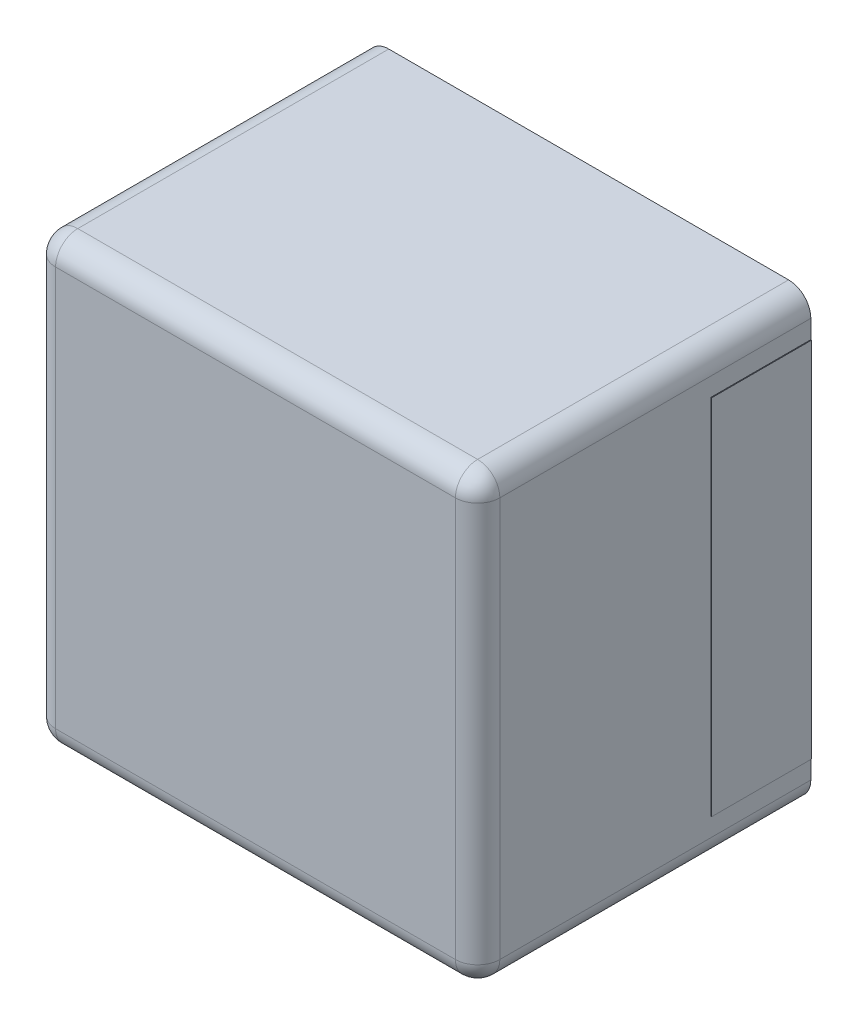
ISO-10303-21;
HEADER;
FILE_DESCRIPTION(('STEP AP214'),'2;1');
FILE_NAME('part.step','',(''),(''),'','','');
FILE_SCHEMA(('AUTOMOTIVE_DESIGN { 1 0 10303 214 1 1 1 1 }'));
ENDSEC;
DATA;
#1=APPLICATION_CONTEXT('core data for automotive mechanical design processes');
#2=APPLICATION_PROTOCOL_DEFINITION('international standard','automotive_design',2000,#1);
#3=PRODUCT_CONTEXT('',#1,'mechanical');
#4=PRODUCT('Part','Part','',(#3));
#5=PRODUCT_RELATED_PRODUCT_CATEGORY('part','',(#4));
#6=PRODUCT_DEFINITION_FORMATION('','',#4);
#7=PRODUCT_DEFINITION_CONTEXT('part definition',#1,'design');
#8=PRODUCT_DEFINITION('design','',#6,#7);
#9=PRODUCT_DEFINITION_SHAPE('','',#8);
#10=(LENGTH_UNIT() NAMED_UNIT(*) SI_UNIT(.MILLI.,.METRE.));
#11=(NAMED_UNIT(*) PLANE_ANGLE_UNIT() SI_UNIT($,.RADIAN.));
#12=(NAMED_UNIT(*) SI_UNIT($,.STERADIAN.) SOLID_ANGLE_UNIT());
#13=UNCERTAINTY_MEASURE_WITH_UNIT(LENGTH_MEASURE(1.E-05),#10,'distance_accuracy_value','');
#14=(GEOMETRIC_REPRESENTATION_CONTEXT(3) GLOBAL_UNCERTAINTY_ASSIGNED_CONTEXT((#13)) GLOBAL_UNIT_ASSIGNED_CONTEXT((#10,
#11,#12)) REPRESENTATION_CONTEXT('',''));
#15=CARTESIAN_POINT('',(0.,0.,0.));
#16=DIRECTION('',(0.,0.,1.));
#17=DIRECTION('',(1.,0.,0.));
#18=AXIS2_PLACEMENT_3D('',#15,#16,#17);
#19=CARTESIAN_POINT('',(-3.01,-2.45,0.));
#20=DIRECTION('',(1.,0.,0.));
#21=DIRECTION('',(0.,0.,-1.));
#22=AXIS2_PLACEMENT_3D('',#19,#20,#21);
#23=PLANE('',#22);
#24=DIRECTION('',(0.,0.,-1.));
#25=VECTOR('',#24,1.);
#26=CARTESIAN_POINT('',(-3.01,2.45,0.));
#27=LINE('',#26,#25);
#28=CARTESIAN_POINT('',(-3.01,2.45,0.));
#29=VERTEX_POINT('',#28);
#30=CARTESIAN_POINT('',(-3.01,2.45,1.35));
#31=VERTEX_POINT('',#30);
#32=EDGE_CURVE('E193',#29,#31,#27,.F.);
#33=ORIENTED_EDGE('',*,*,#32,.F.);
#34=DIRECTION('',(0.,1.,0.));
#35=VECTOR('',#34,1.);
#36=CARTESIAN_POINT('',(-3.01,-2.45,0.));
#37=LINE('',#36,#35);
#38=CARTESIAN_POINT('',(-3.01,-2.45,0.));
#39=VERTEX_POINT('',#38);
#40=EDGE_CURVE('E188',#29,#39,#37,.F.);
#41=ORIENTED_EDGE('',*,*,#40,.T.);
#42=DIRECTION('',(0.,0.,1.));
#43=VECTOR('',#42,1.);
#44=CARTESIAN_POINT('',(-3.01,-2.45,0.));
#45=LINE('',#44,#43);
#46=CARTESIAN_POINT('',(-3.01,-2.45,1.35));
#47=VERTEX_POINT('',#46);
#48=EDGE_CURVE('E206',#39,#47,#45,.T.);
#49=ORIENTED_EDGE('',*,*,#48,.T.);
#50=DIRECTION('',(0.,1.,0.));
#51=VECTOR('',#50,1.);
#52=CARTESIAN_POINT('',(-3.01,-2.45,1.35));
#53=LINE('',#52,#51);
#54=EDGE_CURVE('E202',#31,#47,#53,.F.);
#55=ORIENTED_EDGE('',*,*,#54,.F.);
#56=EDGE_LOOP('',(#33,#41,#49,#55));
#57=FACE_BOUND('',#56,.T.);
#58=ADVANCED_FACE('F17',(#57),#23,.F.);
#59=CARTESIAN_POINT('',(3.01,-2.45,0.));
#60=DIRECTION('',(1.,0.,0.));
#61=DIRECTION('',(0.,0.,-1.));
#62=AXIS2_PLACEMENT_3D('',#59,#60,#61);
#63=PLANE('',#62);
#64=DIRECTION('',(0.,0.,-1.));
#65=VECTOR('',#64,1.);
#66=CARTESIAN_POINT('',(3.01,2.45,0.));
#67=LINE('',#66,#65);
#68=CARTESIAN_POINT('',(3.01,2.45,0.));
#69=VERTEX_POINT('',#68);
#70=CARTESIAN_POINT('',(3.01,2.45,1.35));
#71=VERTEX_POINT('',#70);
#72=EDGE_CURVE('E189',#69,#71,#67,.F.);
#73=ORIENTED_EDGE('',*,*,#72,.T.);
#74=DIRECTION('',(0.,1.,0.));
#75=VECTOR('',#74,1.);
#76=CARTESIAN_POINT('',(3.01,-2.45,1.35));
#77=LINE('',#76,#75);
#78=CARTESIAN_POINT('',(3.01,-2.45,1.35));
#79=VERTEX_POINT('',#78);
#80=EDGE_CURVE('E178',#79,#71,#77,.T.);
#81=ORIENTED_EDGE('',*,*,#80,.F.);
#82=DIRECTION('',(0.,0.,1.));
#83=VECTOR('',#82,1.);
#84=CARTESIAN_POINT('',(3.01,-2.45,0.));
#85=LINE('',#84,#83);
#86=CARTESIAN_POINT('',(3.01,-2.45,0.));
#87=VERTEX_POINT('',#86);
#88=EDGE_CURVE('E196',#79,#87,#85,.F.);
#89=ORIENTED_EDGE('',*,*,#88,.T.);
#90=DIRECTION('',(0.,1.,0.));
#91=VECTOR('',#90,1.);
#92=CARTESIAN_POINT('',(3.01,-2.45,0.));
#93=LINE('',#92,#91);
#94=EDGE_CURVE('E185',#87,#69,#93,.T.);
#95=ORIENTED_EDGE('',*,*,#94,.T.);
#96=EDGE_LOOP('',(#73,#81,#89,#95));
#97=FACE_BOUND('',#96,.T.);
#98=ADVANCED_FACE('F517',(#97),#63,.T.);
#99=CARTESIAN_POINT('',(-3.01,-2.45,0.));
#100=DIRECTION('',(0.,1.,0.));
#101=DIRECTION('',(0.,0.,1.));
#102=AXIS2_PLACEMENT_3D('',#99,#100,#101);
#103=PLANE('',#102);
#104=DIRECTION('',(1.,0.,0.));
#105=VECTOR('',#104,1.);
#106=CARTESIAN_POINT('',(-3.01,-2.45,1.35));
#107=LINE('',#106,#105);
#108=CARTESIAN_POINT('',(-3.,-2.45,1.35));
#109=VERTEX_POINT('',#108);
#110=EDGE_CURVE('E205',#47,#109,#107,.T.);
#111=ORIENTED_EDGE('',*,*,#110,.F.);
#112=ORIENTED_EDGE('',*,*,#48,.F.);
#113=DIRECTION('',(1.,0.,0.));
#114=VECTOR('',#113,1.);
#115=CARTESIAN_POINT('',(-3.01,-2.45,0.));
#116=LINE('',#115,#114);
#117=CARTESIAN_POINT('',(-3.,-2.45,0.));
#118=VERTEX_POINT('',#117);
#119=EDGE_CURVE('E210',#118,#39,#116,.F.);
#120=ORIENTED_EDGE('',*,*,#119,.F.);
#121=DIRECTION('',(0.,0.,-1.));
#122=VECTOR('',#121,1.);
#123=CARTESIAN_POINT('',(-3.,-2.45,0.));
#124=LINE('',#123,#122);
#125=EDGE_CURVE('E168',#118,#109,#124,.F.);
#126=ORIENTED_EDGE('',*,*,#125,.T.);
#127=EDGE_LOOP('',(#111,#112,#120,#126));
#128=FACE_BOUND('',#127,.T.);
#129=ADVANCED_FACE('F328',(#128),#103,.F.);
#130=CARTESIAN_POINT('',(-3.01,-2.45,1.35));
#131=DIRECTION('',(0.,0.,1.));
#132=DIRECTION('',(1.,0.,0.));
#133=AXIS2_PLACEMENT_3D('',#130,#131,#132);
#134=PLANE('',#133);
#135=ORIENTED_EDGE('',*,*,#110,.T.);
#136=DIRECTION('',(0.,1.,0.));
#137=VECTOR('',#136,1.);
#138=CARTESIAN_POINT('',(-3.,-3.,1.35));
#139=LINE('',#138,#137);
#140=CARTESIAN_POINT('',(-3.,2.45,1.35));
#141=VERTEX_POINT('',#140);
#142=EDGE_CURVE('E170',#109,#141,#139,.T.);
#143=ORIENTED_EDGE('',*,*,#142,.T.);
#144=DIRECTION('',(1.,0.,0.));
#145=VECTOR('',#144,1.);
#146=CARTESIAN_POINT('',(-3.01,2.45,1.35));
#147=LINE('',#146,#145);
#148=EDGE_CURVE('E309',#31,#141,#147,.T.);
#149=ORIENTED_EDGE('',*,*,#148,.F.);
#150=ORIENTED_EDGE('',*,*,#54,.T.);
#151=EDGE_LOOP('',(#135,#143,#149,#150));
#152=FACE_BOUND('',#151,.T.);
#153=ADVANCED_FACE('F512',(#152),#134,.T.);
#154=CARTESIAN_POINT('',(-3.01,2.45,0.));
#155=DIRECTION('',(0.,1.,0.));
#156=DIRECTION('',(0.,0.,1.));
#157=AXIS2_PLACEMENT_3D('',#154,#155,#156);
#158=PLANE('',#157);
#159=ORIENTED_EDGE('',*,*,#148,.T.);
#160=DIRECTION('',(0.,0.,-1.));
#161=VECTOR('',#160,1.);
#162=CARTESIAN_POINT('',(-3.,2.45,0.));
#163=LINE('',#162,#161);
#164=CARTESIAN_POINT('',(-3.,2.45,0.));
#165=VERTEX_POINT('',#164);
#166=EDGE_CURVE('E299',#141,#165,#163,.T.);
#167=ORIENTED_EDGE('',*,*,#166,.T.);
#168=DIRECTION('',(1.,0.,0.));
#169=VECTOR('',#168,1.);
#170=CARTESIAN_POINT('',(-3.01,2.45,0.));
#171=LINE('',#170,#169);
#172=EDGE_CURVE('E306',#165,#29,#171,.F.);
#173=ORIENTED_EDGE('',*,*,#172,.T.);
#174=ORIENTED_EDGE('',*,*,#32,.T.);
#175=EDGE_LOOP('',(#159,#167,#173,#174));
#176=FACE_BOUND('',#175,.T.);
#177=ADVANCED_FACE('F333',(#176),#158,.T.);
#178=CARTESIAN_POINT('',(-2.7,-2.7,0.));
#179=DIRECTION('',(0.,0.,1.));
#180=DIRECTION('',(1.,0.,0.));
#181=AXIS2_PLACEMENT_3D('',#178,#179,#180);
#182=CYLINDRICAL_SURFACE('',#181,0.3);
#183=DIRECTION('',(0.,0.,1.));
#184=VECTOR('',#183,1.);
#185=CARTESIAN_POINT('',(-2.7,-3.,0.));
#186=LINE('',#185,#184);
#187=CARTESIAN_POINT('',(-2.7,-3.,0.));
#188=VERTEX_POINT('',#187);
#189=CARTESIAN_POINT('',(-2.7,-3.,4.2));
#190=VERTEX_POINT('',#189);
#191=EDGE_CURVE('E267',#188,#190,#186,.T.);
#192=ORIENTED_EDGE('',*,*,#191,.T.);
#193=CARTESIAN_POINT('',(-2.7,-2.7,4.2));
#194=DIRECTION('',(0.,0.,-1.));
#195=DIRECTION('',(0.,-1.,0.));
#196=AXIS2_PLACEMENT_3D('',#193,#194,#195);
#197=CIRCLE('',#196,0.3);
#198=CARTESIAN_POINT('',(-3.,-2.7,4.2));
#199=VERTEX_POINT('',#198);
#200=EDGE_CURVE('E145',#199,#190,#197,.F.);
#201=ORIENTED_EDGE('',*,*,#200,.F.);
#202=DIRECTION('',(0.,0.,-1.));
#203=VECTOR('',#202,1.);
#204=CARTESIAN_POINT('',(-3.,-2.7,0.));
#205=LINE('',#204,#203);
#206=CARTESIAN_POINT('',(-3.,-2.7,0.));
#207=VERTEX_POINT('',#206);
#208=EDGE_CURVE('E140',#199,#207,#205,.T.);
#209=ORIENTED_EDGE('',*,*,#208,.T.);
#210=CARTESIAN_POINT('',(-2.7,-2.7,0.));
#211=DIRECTION('',(0.,0.,1.));
#212=DIRECTION('',(1.,0.,0.));
#213=AXIS2_PLACEMENT_3D('',#210,#211,#212);
#214=CIRCLE('',#213,0.3);
#215=EDGE_CURVE('E20',#207,#188,#214,.T.);
#216=ORIENTED_EDGE('',*,*,#215,.T.);
#217=EDGE_LOOP('',(#192,#201,#209,#216));
#218=FACE_BOUND('',#217,.T.);
#219=ADVANCED_FACE('F142',(#218),#182,.T.);
#220=CARTESIAN_POINT('',(2.7,-2.7,0.));
#221=DIRECTION('',(0.,0.,1.));
#222=DIRECTION('',(1.,0.,0.));
#223=AXIS2_PLACEMENT_3D('',#220,#221,#222);
#224=CYLINDRICAL_SURFACE('',#223,0.3);
#225=CARTESIAN_POINT('',(2.7,-2.7,0.));
#226=DIRECTION('',(0.,0.,1.));
#227=DIRECTION('',(1.,0.,0.));
#228=AXIS2_PLACEMENT_3D('',#225,#226,#227);
#229=CIRCLE('',#228,0.3);
#230=CARTESIAN_POINT('',(2.7,-3.,0.));
#231=VERTEX_POINT('',#230);
#232=CARTESIAN_POINT('',(3.,-2.7,0.));
#233=VERTEX_POINT('',#232);
#234=EDGE_CURVE('E162',#231,#233,#229,.T.);
#235=ORIENTED_EDGE('',*,*,#234,.T.);
#236=DIRECTION('',(0.,0.,-1.));
#237=VECTOR('',#236,1.);
#238=CARTESIAN_POINT('',(3.,-2.7,0.));
#239=LINE('',#238,#237);
#240=CARTESIAN_POINT('',(3.,-2.7,4.2));
#241=VERTEX_POINT('',#240);
#242=EDGE_CURVE('E225',#241,#233,#239,.T.);
#243=ORIENTED_EDGE('',*,*,#242,.F.);
#244=CARTESIAN_POINT('',(2.7,-2.7,4.2));
#245=DIRECTION('',(0.,0.,-1.));
#246=DIRECTION('',(1.,0.,0.));
#247=AXIS2_PLACEMENT_3D('',#244,#245,#246);
#248=CIRCLE('',#247,0.3);
#249=CARTESIAN_POINT('',(2.7,-3.,4.2));
#250=VERTEX_POINT('',#249);
#251=EDGE_CURVE('E244',#250,#241,#248,.F.);
#252=ORIENTED_EDGE('',*,*,#251,.F.);
#253=DIRECTION('',(0.,0.,1.));
#254=VECTOR('',#253,1.);
#255=CARTESIAN_POINT('',(2.7,-3.,0.));
#256=LINE('',#255,#254);
#257=EDGE_CURVE('E228',#250,#231,#256,.F.);
#258=ORIENTED_EDGE('',*,*,#257,.T.);
#259=EDGE_LOOP('',(#235,#243,#252,#258));
#260=FACE_BOUND('',#259,.T.);
#261=ADVANCED_FACE('F223',(#260),#224,.T.);
#262=CARTESIAN_POINT('',(1.31,-2.45,0.));
#263=DIRECTION('',(0.,1.,0.));
#264=DIRECTION('',(0.,0.,1.));
#265=AXIS2_PLACEMENT_3D('',#262,#263,#264);
#266=PLANE('',#265);
#267=DIRECTION('',(1.,0.,0.));
#268=VECTOR('',#267,1.);
#269=CARTESIAN_POINT('',(1.31,-2.45,1.35));
#270=LINE('',#269,#268);
#271=CARTESIAN_POINT('',(3.,-2.45,1.35));
#272=VERTEX_POINT('',#271);
#273=EDGE_CURVE('E182',#272,#79,#270,.T.);
#274=ORIENTED_EDGE('',*,*,#273,.F.);
#275=DIRECTION('',(0.,0.,-1.));
#276=VECTOR('',#275,1.);
#277=CARTESIAN_POINT('',(3.,-2.45,0.));
#278=LINE('',#277,#276);
#279=CARTESIAN_POINT('',(3.,-2.45,0.));
#280=VERTEX_POINT('',#279);
#281=EDGE_CURVE('E235',#280,#272,#278,.F.);
#282=ORIENTED_EDGE('',*,*,#281,.F.);
#283=DIRECTION('',(1.,0.,0.));
#284=VECTOR('',#283,1.);
#285=CARTESIAN_POINT('',(1.31,-2.45,0.));
#286=LINE('',#285,#284);
#287=EDGE_CURVE('E199',#87,#280,#286,.F.);
#288=ORIENTED_EDGE('',*,*,#287,.F.);
#289=ORIENTED_EDGE('',*,*,#88,.F.);
#290=EDGE_LOOP('',(#274,#282,#288,#289));
#291=FACE_BOUND('',#290,.T.);
#292=ADVANCED_FACE('F385',(#291),#266,.F.);
#293=CARTESIAN_POINT('',(1.31,-2.45,1.35));
#294=DIRECTION('',(0.,0.,1.));
#295=DIRECTION('',(1.,0.,0.));
#296=AXIS2_PLACEMENT_3D('',#293,#294,#295);
#297=PLANE('',#296);
#298=ORIENTED_EDGE('',*,*,#80,.T.);
#299=DIRECTION('',(1.,0.,0.));
#300=VECTOR('',#299,1.);
#301=CARTESIAN_POINT('',(1.31,2.45,1.35));
#302=LINE('',#301,#300);
#303=CARTESIAN_POINT('',(3.,2.45,1.35));
#304=VERTEX_POINT('',#303);
#305=EDGE_CURVE('E163',#304,#71,#302,.T.);
#306=ORIENTED_EDGE('',*,*,#305,.F.);
#307=DIRECTION('',(0.,1.,0.));
#308=VECTOR('',#307,1.);
#309=CARTESIAN_POINT('',(3.,-3.,1.35));
#310=LINE('',#309,#308);
#311=EDGE_CURVE('E360',#272,#304,#310,.T.);
#312=ORIENTED_EDGE('',*,*,#311,.F.);
#313=ORIENTED_EDGE('',*,*,#273,.T.);
#314=EDGE_LOOP('',(#298,#306,#312,#313));
#315=FACE_BOUND('',#314,.T.);
#316=ADVANCED_FACE('F388',(#315),#297,.T.);
#317=CARTESIAN_POINT('',(1.31,2.45,0.));
#318=DIRECTION('',(0.,1.,0.));
#319=DIRECTION('',(0.,0.,1.));
#320=AXIS2_PLACEMENT_3D('',#317,#318,#319);
#321=PLANE('',#320);
#322=ORIENTED_EDGE('',*,*,#305,.T.);
#323=ORIENTED_EDGE('',*,*,#72,.F.);
#324=DIRECTION('',(1.,0.,0.));
#325=VECTOR('',#324,1.);
#326=CARTESIAN_POINT('',(1.31,2.45,0.));
#327=LINE('',#326,#325);
#328=CARTESIAN_POINT('',(3.,2.45,0.));
#329=VERTEX_POINT('',#328);
#330=EDGE_CURVE('E181',#69,#329,#327,.F.);
#331=ORIENTED_EDGE('',*,*,#330,.T.);
#332=DIRECTION('',(0.,0.,-1.));
#333=VECTOR('',#332,1.);
#334=CARTESIAN_POINT('',(3.,2.45,0.));
#335=LINE('',#334,#333);
#336=EDGE_CURVE('E355',#304,#329,#335,.T.);
#337=ORIENTED_EDGE('',*,*,#336,.F.);
#338=EDGE_LOOP('',(#322,#323,#331,#337));
#339=FACE_BOUND('',#338,.T.);
#340=ADVANCED_FACE('F391',(#339),#321,.T.);
#341=CARTESIAN_POINT('',(-2.7,2.7,0.));
#342=DIRECTION('',(0.,0.,1.));
#343=DIRECTION('',(1.,0.,0.));
#344=AXIS2_PLACEMENT_3D('',#341,#342,#343);
#345=CYLINDRICAL_SURFACE('',#344,0.3);
#346=CARTESIAN_POINT('',(-2.7,2.7,0.));
#347=DIRECTION('',(0.,0.,1.));
#348=DIRECTION('',(1.,0.,0.));
#349=AXIS2_PLACEMENT_3D('',#346,#347,#348);
#350=CIRCLE('',#349,0.3);
#351=CARTESIAN_POINT('',(-2.7,3.,0.));
#352=VERTEX_POINT('',#351);
#353=CARTESIAN_POINT('',(-3.,2.7,0.));
#354=VERTEX_POINT('',#353);
#355=EDGE_CURVE('E152',#352,#354,#350,.T.);
#356=ORIENTED_EDGE('',*,*,#355,.T.);
#357=DIRECTION('',(0.,0.,-1.));
#358=VECTOR('',#357,1.);
#359=CARTESIAN_POINT('',(-3.,2.7,0.));
#360=LINE('',#359,#358);
#361=CARTESIAN_POINT('',(-3.,2.7,4.2));
#362=VERTEX_POINT('',#361);
#363=EDGE_CURVE('E280',#354,#362,#360,.F.);
#364=ORIENTED_EDGE('',*,*,#363,.T.);
#365=CARTESIAN_POINT('',(-2.7,2.7,4.2));
#366=DIRECTION('',(0.,0.,-1.));
#367=DIRECTION('',(-1.,0.,0.));
#368=AXIS2_PLACEMENT_3D('',#365,#366,#367);
#369=CIRCLE('',#368,0.3);
#370=CARTESIAN_POINT('',(-2.7,3.,4.2));
#371=VERTEX_POINT('',#370);
#372=EDGE_CURVE('E399',#371,#362,#369,.F.);
#373=ORIENTED_EDGE('',*,*,#372,.F.);
#374=DIRECTION('',(0.,0.,1.));
#375=VECTOR('',#374,1.);
#376=CARTESIAN_POINT('',(-2.7,3.,0.));
#377=LINE('',#376,#375);
#378=EDGE_CURVE('E423',#352,#371,#377,.T.);
#379=ORIENTED_EDGE('',*,*,#378,.F.);
#380=EDGE_LOOP('',(#356,#364,#373,#379));
#381=FACE_BOUND('',#380,.T.);
#382=ADVANCED_FACE('F422',(#381),#345,.T.);
#383=CARTESIAN_POINT('',(2.7,2.7,0.));
#384=DIRECTION('',(0.,0.,1.));
#385=DIRECTION('',(1.,0.,0.));
#386=AXIS2_PLACEMENT_3D('',#383,#384,#385);
#387=CYLINDRICAL_SURFACE('',#386,0.3);
#388=DIRECTION('',(0.,0.,1.));
#389=VECTOR('',#388,1.);
#390=CARTESIAN_POINT('',(2.7,3.,0.));
#391=LINE('',#390,#389);
#392=CARTESIAN_POINT('',(2.7,3.,4.2));
#393=VERTEX_POINT('',#392);
#394=CARTESIAN_POINT('',(2.7,3.,0.));
#395=VERTEX_POINT('',#394);
#396=EDGE_CURVE('E427',#393,#395,#391,.F.);
#397=ORIENTED_EDGE('',*,*,#396,.F.);
#398=CARTESIAN_POINT('',(2.7,2.7,4.2));
#399=DIRECTION('',(0.,0.,-1.));
#400=DIRECTION('',(0.,1.,0.));
#401=AXIS2_PLACEMENT_3D('',#398,#399,#400);
#402=CIRCLE('',#401,0.3);
#403=CARTESIAN_POINT('',(3.,2.7,4.2));
#404=VERTEX_POINT('',#403);
#405=EDGE_CURVE('E398',#404,#393,#402,.F.);
#406=ORIENTED_EDGE('',*,*,#405,.F.);
#407=DIRECTION('',(0.,0.,-1.));
#408=VECTOR('',#407,1.);
#409=CARTESIAN_POINT('',(3.,2.7,0.));
#410=LINE('',#409,#408);
#411=CARTESIAN_POINT('',(3.,2.7,0.));
#412=VERTEX_POINT('',#411);
#413=EDGE_CURVE('E354',#412,#404,#410,.F.);
#414=ORIENTED_EDGE('',*,*,#413,.F.);
#415=CARTESIAN_POINT('',(2.7,2.7,0.));
#416=DIRECTION('',(0.,0.,1.));
#417=DIRECTION('',(1.,0.,0.));
#418=AXIS2_PLACEMENT_3D('',#415,#416,#417);
#419=CIRCLE('',#418,0.3);
#420=EDGE_CURVE('E220',#412,#395,#419,.T.);
#421=ORIENTED_EDGE('',*,*,#420,.T.);
#422=EDGE_LOOP('',(#397,#406,#414,#421));
#423=FACE_BOUND('',#422,.T.);
#424=ADVANCED_FACE('F397',(#423),#387,.T.);
#425=CARTESIAN_POINT('',(-3.,-3.,0.));
#426=DIRECTION('',(0.,0.,1.));
#427=DIRECTION('',(1.,0.,0.));
#428=AXIS2_PLACEMENT_3D('',#425,#426,#427);
#429=PLANE('',#428);
#430=DIRECTION('',(0.,1.,0.));
#431=VECTOR('',#430,1.);
#432=CARTESIAN_POINT('',(-3.,-3.,0.));
#433=LINE('',#432,#431);
#434=EDGE_CURVE('E151',#207,#118,#433,.T.);
#435=ORIENTED_EDGE('',*,*,#434,.T.);
#436=ORIENTED_EDGE('',*,*,#119,.T.);
#437=ORIENTED_EDGE('',*,*,#40,.F.);
#438=ORIENTED_EDGE('',*,*,#172,.F.);
#439=DIRECTION('',(0.,1.,0.));
#440=VECTOR('',#439,1.);
#441=CARTESIAN_POINT('',(-3.,-3.,0.));
#442=LINE('',#441,#440);
#443=EDGE_CURVE('E296',#165,#354,#442,.T.);
#444=ORIENTED_EDGE('',*,*,#443,.T.);
#445=ORIENTED_EDGE('',*,*,#355,.F.);
#446=DIRECTION('',(1.,0.,0.));
#447=VECTOR('',#446,1.);
#448=CARTESIAN_POINT('',(-3.,3.,0.));
#449=LINE('',#448,#447);
#450=EDGE_CURVE('E291',#395,#352,#449,.F.);
#451=ORIENTED_EDGE('',*,*,#450,.F.);
#452=ORIENTED_EDGE('',*,*,#420,.F.);
#453=DIRECTION('',(0.,1.,0.));
#454=VECTOR('',#453,1.);
#455=CARTESIAN_POINT('',(3.,-3.,0.));
#456=LINE('',#455,#454);
#457=EDGE_CURVE('E352',#329,#412,#456,.T.);
#458=ORIENTED_EDGE('',*,*,#457,.F.);
#459=ORIENTED_EDGE('',*,*,#330,.F.);
#460=ORIENTED_EDGE('',*,*,#94,.F.);
#461=ORIENTED_EDGE('',*,*,#287,.T.);
#462=DIRECTION('',(0.,1.,0.));
#463=VECTOR('',#462,1.);
#464=CARTESIAN_POINT('',(3.,-3.,0.));
#465=LINE('',#464,#463);
#466=EDGE_CURVE('E230',#233,#280,#465,.T.);
#467=ORIENTED_EDGE('',*,*,#466,.F.);
#468=ORIENTED_EDGE('',*,*,#234,.F.);
#469=DIRECTION('',(1.,0.,0.));
#470=VECTOR('',#469,1.);
#471=CARTESIAN_POINT('',(-3.,-3.,0.));
#472=LINE('',#471,#470);
#473=EDGE_CURVE('E160',#231,#188,#472,.F.);
#474=ORIENTED_EDGE('',*,*,#473,.T.);
#475=ORIENTED_EDGE('',*,*,#215,.F.);
#476=EDGE_LOOP('',(#435,#436,#437,#438,#444,#445,#451,#452,#458,#459,#460,#461,#467,#468,#474,#475));
#477=FACE_BOUND('',#476,.T.);
#478=ADVANCED_FACE('F155',(#477),#429,.F.);
#479=CARTESIAN_POINT('',(-3.,-3.,0.));
#480=DIRECTION('',(1.,0.,0.));
#481=DIRECTION('',(0.,0.,-1.));
#482=AXIS2_PLACEMENT_3D('',#479,#480,#481);
#483=PLANE('',#482);
#484=ORIENTED_EDGE('',*,*,#443,.F.);
#485=ORIENTED_EDGE('',*,*,#166,.F.);
#486=ORIENTED_EDGE('',*,*,#142,.F.);
#487=ORIENTED_EDGE('',*,*,#125,.F.);
#488=ORIENTED_EDGE('',*,*,#434,.F.);
#489=ORIENTED_EDGE('',*,*,#208,.F.);
#490=DIRECTION('',(0.,1.,0.));
#491=VECTOR('',#490,1.);
#492=CARTESIAN_POINT('',(-3.,-2.7,4.2));
#493=LINE('',#492,#491);
#494=EDGE_CURVE('E263',#362,#199,#493,.F.);
#495=ORIENTED_EDGE('',*,*,#494,.F.);
#496=ORIENTED_EDGE('',*,*,#363,.F.);
#497=EDGE_LOOP('',(#484,#485,#486,#487,#488,#489,#495,#496));
#498=FACE_BOUND('',#497,.T.);
#499=ADVANCED_FACE('F166',(#498),#483,.F.);
#500=CARTESIAN_POINT('',(-2.7,-2.7,4.2));
#501=DIRECTION('',(0.,-1.,0.));
#502=DIRECTION('',(1.,0.,0.));
#503=AXIS2_PLACEMENT_3D('',#500,#501,#502);
#504=SPHERICAL_SURFACE('',#503,0.3);
#505=ORIENTED_EDGE('',*,*,#200,.T.);
#506=CARTESIAN_POINT('',(-2.7,-2.7,4.2));
#507=DIRECTION('',(-1.,0.,0.));
#508=DIRECTION('',(0.,0.,1.));
#509=AXIS2_PLACEMENT_3D('',#506,#507,#508);
#510=CIRCLE('',#509,0.3);
#511=CARTESIAN_POINT('',(-2.69999999999847,-2.7,4.5));
#512=VERTEX_POINT('',#511);
#513=EDGE_CURVE('E262',#512,#190,#510,.F.);
#514=ORIENTED_EDGE('',*,*,#513,.F.);
#515=CARTESIAN_POINT('',(-2.7,-2.7,4.2));
#516=DIRECTION('',(0.,1.,0.));
#517=DIRECTION('',(0.,0.,1.));
#518=AXIS2_PLACEMENT_3D('',#515,#516,#517);
#519=CIRCLE('',#518,0.3);
#520=EDGE_CURVE('E287',#199,#512,#519,.T.);
#521=ORIENTED_EDGE('',*,*,#520,.F.);
#522=EDGE_LOOP('',(#505,#514,#521));
#523=FACE_BOUND('',#522,.T.);
#524=ADVANCED_FACE('F488',(#523),#504,.T.);
#525=CARTESIAN_POINT('',(-3.,-3.,0.));
#526=DIRECTION('',(0.,1.,0.));
#527=DIRECTION('',(0.,0.,1.));
#528=AXIS2_PLACEMENT_3D('',#525,#526,#527);
#529=PLANE('',#528);
#530=ORIENTED_EDGE('',*,*,#257,.F.);
#531=DIRECTION('',(-1.,0.,0.));
#532=VECTOR('',#531,1.);
#533=CARTESIAN_POINT('',(2.7,-3.,4.2));
#534=LINE('',#533,#532);
#535=EDGE_CURVE('E270',#190,#250,#534,.F.);
#536=ORIENTED_EDGE('',*,*,#535,.F.);
#537=ORIENTED_EDGE('',*,*,#191,.F.);
#538=ORIENTED_EDGE('',*,*,#473,.F.);
#539=EDGE_LOOP('',(#530,#536,#537,#538));
#540=FACE_BOUND('',#539,.T.);
#541=ADVANCED_FACE('F482',(#540),#529,.F.);
#542=CARTESIAN_POINT('',(2.7,-2.7,4.2));
#543=DIRECTION('',(1.,0.,0.));
#544=DIRECTION('',(0.,1.,0.));
#545=AXIS2_PLACEMENT_3D('',#542,#543,#544);
#546=SPHERICAL_SURFACE('',#545,0.3);
#547=ORIENTED_EDGE('',*,*,#251,.T.);
#548=CARTESIAN_POINT('',(2.7,-2.7,4.2));
#549=DIRECTION('',(0.,-1.,0.));
#550=DIRECTION('',(0.,0.,-1.));
#551=AXIS2_PLACEMENT_3D('',#548,#549,#550);
#552=CIRCLE('',#551,0.3);
#553=CARTESIAN_POINT('',(2.7,-2.69999999999847,4.5));
#554=VERTEX_POINT('',#553);
#555=EDGE_CURVE('E254',#554,#241,#552,.F.);
#556=ORIENTED_EDGE('',*,*,#555,.F.);
#557=CARTESIAN_POINT('',(2.7,-2.7,4.2));
#558=DIRECTION('',(-1.,0.,0.));
#559=DIRECTION('',(0.,0.,1.));
#560=AXIS2_PLACEMENT_3D('',#557,#558,#559);
#561=CIRCLE('',#560,0.3);
#562=EDGE_CURVE('E259',#250,#554,#561,.T.);
#563=ORIENTED_EDGE('',*,*,#562,.F.);
#564=EDGE_LOOP('',(#547,#556,#563));
#565=FACE_BOUND('',#564,.T.);
#566=ADVANCED_FACE('F479',(#565),#546,.T.);
#567=CARTESIAN_POINT('',(3.,-3.,0.));
#568=DIRECTION('',(1.,0.,0.));
#569=DIRECTION('',(0.,0.,-1.));
#570=AXIS2_PLACEMENT_3D('',#567,#568,#569);
#571=PLANE('',#570);
#572=ORIENTED_EDGE('',*,*,#457,.T.);
#573=ORIENTED_EDGE('',*,*,#413,.T.);
#574=DIRECTION('',(0.,-1.,0.));
#575=VECTOR('',#574,1.);
#576=CARTESIAN_POINT('',(3.,2.7,4.2));
#577=LINE('',#576,#575);
#578=EDGE_CURVE('E242',#241,#404,#577,.F.);
#579=ORIENTED_EDGE('',*,*,#578,.F.);
#580=ORIENTED_EDGE('',*,*,#242,.T.);
#581=ORIENTED_EDGE('',*,*,#466,.T.);
#582=ORIENTED_EDGE('',*,*,#281,.T.);
#583=ORIENTED_EDGE('',*,*,#311,.T.);
#584=ORIENTED_EDGE('',*,*,#336,.T.);
#585=EDGE_LOOP('',(#572,#573,#579,#580,#581,#582,#583,#584));
#586=FACE_BOUND('',#585,.T.);
#587=ADVANCED_FACE('F239',(#586),#571,.T.);
#588=CARTESIAN_POINT('',(-2.7,2.7,4.2));
#589=DIRECTION('',(-1.,0.,0.));
#590=DIRECTION('',(0.,-1.,0.));
#591=AXIS2_PLACEMENT_3D('',#588,#589,#590);
#592=SPHERICAL_SURFACE('',#591,0.3);
#593=ORIENTED_EDGE('',*,*,#372,.T.);
#594=CARTESIAN_POINT('',(-2.7,2.7,4.2));
#595=DIRECTION('',(0.,1.,0.));
#596=DIRECTION('',(0.,0.,1.));
#597=AXIS2_PLACEMENT_3D('',#594,#595,#596);
#598=CIRCLE('',#597,0.3);
#599=CARTESIAN_POINT('',(-2.7,2.69999999999847,4.5));
#600=VERTEX_POINT('',#599);
#601=EDGE_CURVE('E290',#600,#362,#598,.F.);
#602=ORIENTED_EDGE('',*,*,#601,.F.);
#603=CARTESIAN_POINT('',(-2.7,2.7,4.2));
#604=DIRECTION('',(1.,0.,0.));
#605=DIRECTION('',(0.,0.,-1.));
#606=AXIS2_PLACEMENT_3D('',#603,#604,#605);
#607=CIRCLE('',#606,0.3);
#608=EDGE_CURVE('E409',#371,#600,#607,.T.);
#609=ORIENTED_EDGE('',*,*,#608,.F.);
#610=EDGE_LOOP('',(#593,#602,#609));
#611=FACE_BOUND('',#610,.T.);
#612=ADVANCED_FACE('F420',(#611),#592,.T.);
#613=CARTESIAN_POINT('',(2.7,2.7,4.2));
#614=DIRECTION('',(0.,1.,0.));
#615=DIRECTION('',(-1.,0.,0.));
#616=AXIS2_PLACEMENT_3D('',#613,#614,#615);
#617=SPHERICAL_SURFACE('',#616,0.3);
#618=ORIENTED_EDGE('',*,*,#405,.T.);
#619=CARTESIAN_POINT('',(2.7,2.7,4.2));
#620=DIRECTION('',(1.,0.,0.));
#621=DIRECTION('',(0.,0.,-1.));
#622=AXIS2_PLACEMENT_3D('',#619,#620,#621);
#623=CIRCLE('',#622,0.3);
#624=CARTESIAN_POINT('',(2.69999999999847,2.7,4.5));
#625=VERTEX_POINT('',#624);
#626=EDGE_CURVE('E35',#625,#393,#623,.F.);
#627=ORIENTED_EDGE('',*,*,#626,.F.);
#628=CARTESIAN_POINT('',(2.7,2.7,4.2));
#629=DIRECTION('',(0.,-1.,0.));
#630=DIRECTION('',(0.,0.,-1.));
#631=AXIS2_PLACEMENT_3D('',#628,#629,#630);
#632=CIRCLE('',#631,0.3);
#633=EDGE_CURVE('E256',#404,#625,#632,.T.);
#634=ORIENTED_EDGE('',*,*,#633,.F.);
#635=EDGE_LOOP('',(#618,#627,#634));
#636=FACE_BOUND('',#635,.T.);
#637=ADVANCED_FACE('F469',(#636),#617,.T.);
#638=CARTESIAN_POINT('',(-3.,3.,0.));
#639=DIRECTION('',(0.,1.,0.));
#640=DIRECTION('',(0.,0.,1.));
#641=AXIS2_PLACEMENT_3D('',#638,#639,#640);
#642=PLANE('',#641);
#643=ORIENTED_EDGE('',*,*,#396,.T.);
#644=ORIENTED_EDGE('',*,*,#450,.T.);
#645=ORIENTED_EDGE('',*,*,#378,.T.);
#646=DIRECTION('',(1.,0.,0.));
#647=VECTOR('',#646,1.);
#648=CARTESIAN_POINT('',(-2.7,3.,4.2));
#649=LINE('',#648,#647);
#650=EDGE_CURVE('E438',#393,#371,#649,.F.);
#651=ORIENTED_EDGE('',*,*,#650,.F.);
#652=EDGE_LOOP('',(#643,#644,#645,#651));
#653=FACE_BOUND('',#652,.T.);
#654=ADVANCED_FACE('F473',(#653),#642,.T.);
#655=CARTESIAN_POINT('',(-2.7,-2.7,4.2));
#656=DIRECTION('',(0.,1.,0.));
#657=DIRECTION('',(0.,0.,1.));
#658=AXIS2_PLACEMENT_3D('',#655,#656,#657);
#659=CYLINDRICAL_SURFACE('',#658,0.3);
#660=ORIENTED_EDGE('',*,*,#601,.T.);
#661=ORIENTED_EDGE('',*,*,#494,.T.);
#662=ORIENTED_EDGE('',*,*,#520,.T.);
#663=DIRECTION('',(0.,1.,0.));
#664=VECTOR('',#663,1.);
#665=CARTESIAN_POINT('',(-2.7,-3.,4.5));
#666=LINE('',#665,#664);
#667=EDGE_CURVE('E416',#600,#512,#666,.F.);
#668=ORIENTED_EDGE('',*,*,#667,.F.);
#669=EDGE_LOOP('',(#660,#661,#662,#668));
#670=FACE_BOUND('',#669,.T.);
#671=ADVANCED_FACE('F412',(#670),#659,.T.);
#672=CARTESIAN_POINT('',(2.7,-2.7,4.2));
#673=DIRECTION('',(-1.,0.,0.));
#674=DIRECTION('',(0.,0.,1.));
#675=AXIS2_PLACEMENT_3D('',#672,#673,#674);
#676=CYLINDRICAL_SURFACE('',#675,0.3);
#677=ORIENTED_EDGE('',*,*,#513,.T.);
#678=ORIENTED_EDGE('',*,*,#535,.T.);
#679=ORIENTED_EDGE('',*,*,#562,.T.);
#680=DIRECTION('',(1.,0.,0.));
#681=VECTOR('',#680,1.);
#682=CARTESIAN_POINT('',(-3.,-2.7,4.5));
#683=LINE('',#682,#681);
#684=EDGE_CURVE('E459',#512,#554,#683,.T.);
#685=ORIENTED_EDGE('',*,*,#684,.F.);
#686=EDGE_LOOP('',(#677,#678,#679,#685));
#687=FACE_BOUND('',#686,.T.);
#688=ADVANCED_FACE('F533',(#687),#676,.T.);
#689=CARTESIAN_POINT('',(2.7,2.7,4.2));
#690=DIRECTION('',(0.,-1.,0.));
#691=DIRECTION('',(0.,0.,-1.));
#692=AXIS2_PLACEMENT_3D('',#689,#690,#691);
#693=CYLINDRICAL_SURFACE('',#692,0.3);
#694=ORIENTED_EDGE('',*,*,#555,.T.);
#695=ORIENTED_EDGE('',*,*,#578,.T.);
#696=ORIENTED_EDGE('',*,*,#633,.T.);
#697=DIRECTION('',(0.,1.,0.));
#698=VECTOR('',#697,1.);
#699=CARTESIAN_POINT('',(2.7,-3.,4.5));
#700=LINE('',#699,#698);
#701=EDGE_CURVE('E26',#554,#625,#700,.T.);
#702=ORIENTED_EDGE('',*,*,#701,.F.);
#703=EDGE_LOOP('',(#694,#695,#696,#702));
#704=FACE_BOUND('',#703,.T.);
#705=ADVANCED_FACE('F452',(#704),#693,.T.);
#706=CARTESIAN_POINT('',(-2.7,2.7,4.2));
#707=DIRECTION('',(1.,0.,0.));
#708=DIRECTION('',(0.,0.,-1.));
#709=AXIS2_PLACEMENT_3D('',#706,#707,#708);
#710=CYLINDRICAL_SURFACE('',#709,0.3);
#711=ORIENTED_EDGE('',*,*,#626,.T.);
#712=ORIENTED_EDGE('',*,*,#650,.T.);
#713=ORIENTED_EDGE('',*,*,#608,.T.);
#714=DIRECTION('',(1.,0.,0.));
#715=VECTOR('',#714,1.);
#716=CARTESIAN_POINT('',(-3.,2.7,4.5));
#717=LINE('',#716,#715);
#718=EDGE_CURVE('E11',#625,#600,#717,.F.);
#719=ORIENTED_EDGE('',*,*,#718,.F.);
#720=EDGE_LOOP('',(#711,#712,#713,#719));
#721=FACE_BOUND('',#720,.T.);
#722=ADVANCED_FACE('F456',(#721),#710,.T.);
#723=CARTESIAN_POINT('',(-3.,-3.,4.5));
#724=DIRECTION('',(0.,0.,1.));
#725=DIRECTION('',(1.,0.,0.));
#726=AXIS2_PLACEMENT_3D('',#723,#724,#725);
#727=PLANE('',#726);
#728=ORIENTED_EDGE('',*,*,#701,.T.);
#729=ORIENTED_EDGE('',*,*,#718,.T.);
#730=ORIENTED_EDGE('',*,*,#667,.T.);
#731=ORIENTED_EDGE('',*,*,#684,.T.);
#732=EDGE_LOOP('',(#728,#729,#730,#731));
#733=FACE_BOUND('',#732,.T.);
#734=ADVANCED_FACE('F458',(#733),#727,.T.);
#735=CLOSED_SHELL('',(#58,#98,#129,#153,#177,#219,#261,#292,#316,#340,#382,#424,#478,#499,#524,
#541,#566,#587,#612,#637,#654,#671,#688,#705,#722,#734));
#736=MANIFOLD_SOLID_BREP('B1',#735);
#737=ADVANCED_BREP_SHAPE_REPRESENTATION('',(#18,#736),#14);
#738=SHAPE_DEFINITION_REPRESENTATION(#9,#737);
ENDSEC;
END-ISO-10303-21;
